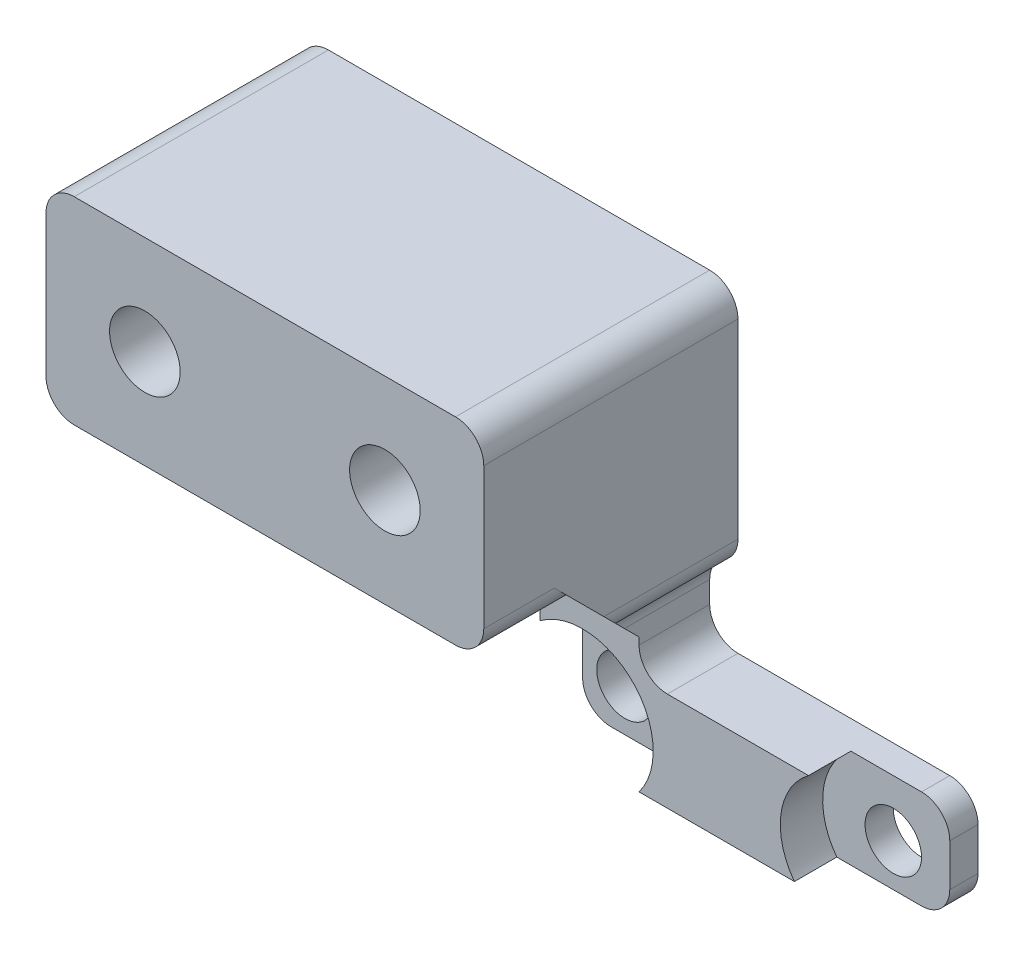
ISO-10303-21;
HEADER;
FILE_DESCRIPTION(('STEP AP214'),'2;1');
FILE_NAME('part.step','',(''),(''),'','','');
FILE_SCHEMA(('AUTOMOTIVE_DESIGN { 1 0 10303 214 1 1 1 1 }'));
ENDSEC;
DATA;
#1=APPLICATION_CONTEXT('core data for automotive mechanical design processes');
#2=APPLICATION_PROTOCOL_DEFINITION('international standard','automotive_design',2000,#1);
#3=PRODUCT_CONTEXT('',#1,'mechanical');
#4=PRODUCT('Part','Part','',(#3));
#5=PRODUCT_RELATED_PRODUCT_CATEGORY('part','',(#4));
#6=PRODUCT_DEFINITION_FORMATION('','',#4);
#7=PRODUCT_DEFINITION_CONTEXT('part definition',#1,'design');
#8=PRODUCT_DEFINITION('design','',#6,#7);
#9=PRODUCT_DEFINITION_SHAPE('','',#8);
#10=(LENGTH_UNIT() NAMED_UNIT(*) SI_UNIT(.MILLI.,.METRE.));
#11=(NAMED_UNIT(*) PLANE_ANGLE_UNIT() SI_UNIT($,.RADIAN.));
#12=(NAMED_UNIT(*) SI_UNIT($,.STERADIAN.) SOLID_ANGLE_UNIT());
#13=UNCERTAINTY_MEASURE_WITH_UNIT(LENGTH_MEASURE(1.E-05),#10,'distance_accuracy_value','');
#14=(GEOMETRIC_REPRESENTATION_CONTEXT(3) GLOBAL_UNCERTAINTY_ASSIGNED_CONTEXT((#13)) GLOBAL_UNIT_ASSIGNED_CONTEXT((#10,
#11,#12)) REPRESENTATION_CONTEXT('',''));
#15=CARTESIAN_POINT('',(0.,0.,0.));
#16=DIRECTION('',(0.,0.,1.));
#17=DIRECTION('',(1.,0.,0.));
#18=AXIS2_PLACEMENT_3D('',#15,#16,#17);
#19=CARTESIAN_POINT('',(-17.2611972553893,18.0150602409639,8.));
#20=DIRECTION('',(0.,0.,-1.));
#21=DIRECTION('',(-1.,0.,0.));
#22=AXIS2_PLACEMENT_3D('',#19,#20,#21);
#23=PLANE('',#22);
#24=CARTESIAN_POINT('',(-17.2611972553893,18.0150602409639,8.));
#25=DIRECTION('',(0.,0.,-1.));
#26=DIRECTION('',(-1.,0.,0.));
#27=AXIS2_PLACEMENT_3D('',#24,#25,#26);
#28=CIRCLE('',#27,2.5);
#29=CARTESIAN_POINT('',(-19.7611972553893,18.0150602409639,8.));
#30=VERTEX_POINT('',#29);
#31=EDGE_CURVE('E429',#30,#30,#28,.F.);
#32=ORIENTED_EDGE('',*,*,#31,.T.);
#33=EDGE_LOOP('',(#32));
#34=FACE_BOUND('',#33,.T.);
#35=CARTESIAN_POINT('',(-17.2611972553893,18.0150602409639,8.));
#36=DIRECTION('',(0.,0.,-1.));
#37=DIRECTION('',(-1.,0.,0.));
#38=AXIS2_PLACEMENT_3D('',#35,#36,#37);
#39=CIRCLE('',#38,3.75);
#40=CARTESIAN_POINT('',(-21.0111972553893,18.0150602409639,8.));
#41=VERTEX_POINT('',#40);
#42=EDGE_CURVE('E415',#41,#41,#39,.T.);
#43=ORIENTED_EDGE('',*,*,#42,.T.);
#44=EDGE_LOOP('',(#43));
#45=FACE_BOUND('',#44,.T.);
#46=ADVANCED_FACE('F34',(#34,#45),#23,.T.);
#47=CARTESIAN_POINT('',(-0.261197255389315,18.0150602409639,8.));
#48=DIRECTION('',(0.,0.,-1.));
#49=DIRECTION('',(-1.,0.,0.));
#50=AXIS2_PLACEMENT_3D('',#47,#48,#49);
#51=CIRCLE('',#50,2.5);
#52=CARTESIAN_POINT('',(-2.76119725538932,18.0150602409639,8.));
#53=VERTEX_POINT('',#52);
#54=EDGE_CURVE('E422',#53,#53,#51,.F.);
#55=ORIENTED_EDGE('',*,*,#54,.T.);
#56=EDGE_LOOP('',(#55));
#57=FACE_BOUND('',#56,.T.);
#58=CARTESIAN_POINT('',(-0.261197255389315,18.0150602409639,8.));
#59=DIRECTION('',(0.,0.,-1.));
#60=DIRECTION('',(-1.,0.,0.));
#61=AXIS2_PLACEMENT_3D('',#58,#59,#60);
#62=CIRCLE('',#61,3.75);
#63=CARTESIAN_POINT('',(-4.01119725538931,18.0150602409639,8.));
#64=VERTEX_POINT('',#63);
#65=EDGE_CURVE('E418',#64,#64,#62,.T.);
#66=ORIENTED_EDGE('',*,*,#65,.T.);
#67=EDGE_LOOP('',(#66));
#68=FACE_BOUND('',#67,.T.);
#69=ADVANCED_FACE('F537',(#57,#68),#23,.T.);
#70=CARTESIAN_POINT('',(0.,0.,5.));
#71=DIRECTION('',(0.,0.,1.));
#72=DIRECTION('',(1.,0.,0.));
#73=AXIS2_PLACEMENT_3D('',#70,#71,#72);
#74=PLANE('',#73);
#75=DIRECTION('',(-1.,0.,0.));
#76=VECTOR('',#75,1.);
#77=CARTESIAN_POINT('',(0.,2.51506024096387,5.));
#78=LINE('',#77,#76);
#79=CARTESIAN_POINT('',(16.7388027446107,2.51506024096387,5.));
#80=VERTEX_POINT('',#79);
#81=CARTESIAN_POINT('',(6.73880274461068,2.51506024096387,5.));
#82=VERTEX_POINT('',#81);
#83=EDGE_CURVE('E313',#80,#82,#78,.T.);
#84=ORIENTED_EDGE('',*,*,#83,.T.);
#85=CARTESIAN_POINT('',(6.73880274461068,4.51506024096387,5.));
#86=DIRECTION('',(0.,0.,1.));
#87=DIRECTION('',(1.,0.,0.));
#88=AXIS2_PLACEMENT_3D('',#85,#86,#87);
#89=CIRCLE('',#88,2.);
#90=CARTESIAN_POINT('',(4.73880274461068,4.51506024096387,5.));
#91=VERTEX_POINT('',#90);
#92=EDGE_CURVE('E228',#82,#91,#89,.F.);
#93=ORIENTED_EDGE('',*,*,#92,.T.);
#94=DIRECTION('',(0.,1.,0.));
#95=VECTOR('',#94,1.);
#96=CARTESIAN_POINT('',(4.73880274461068,0.,5.));
#97=LINE('',#96,#95);
#98=CARTESIAN_POINT('',(4.73880274461068,5.01506024096389,5.));
#99=VERTEX_POINT('',#98);
#100=EDGE_CURVE('E213',#91,#99,#97,.T.);
#101=ORIENTED_EDGE('',*,*,#100,.T.);
#102=DIRECTION('',(-1.,0.,0.));
#103=VECTOR('',#102,1.);
#104=CARTESIAN_POINT('',(0.,5.01506024096389,5.));
#105=LINE('',#104,#103);
#106=CARTESIAN_POINT('',(-2.26119725538932,5.01506024096389,5.));
#107=VERTEX_POINT('',#106);
#108=EDGE_CURVE('E225',#99,#107,#105,.T.);
#109=ORIENTED_EDGE('',*,*,#108,.T.);
#110=DIRECTION('',(0.,1.,0.));
#111=VECTOR('',#110,1.);
#112=CARTESIAN_POINT('',(-2.26119725538932,0.,5.));
#113=LINE('',#112,#111);
#114=CARTESIAN_POINT('',(-2.26119725538932,2.51506024096387,5.));
#115=VERTEX_POINT('',#114);
#116=EDGE_CURVE('E309',#115,#107,#113,.T.);
#117=ORIENTED_EDGE('',*,*,#116,.F.);
#118=CARTESIAN_POINT('',(0.738802744610682,-1.48493975903613,5.));
#119=DIRECTION('',(0.,0.,1.));
#120=DIRECTION('',(1.,0.,0.));
#121=AXIS2_PLACEMENT_3D('',#118,#119,#120);
#122=CIRCLE('',#121,5.);
#123=CARTESIAN_POINT('',(4.73880274461069,-4.48493975903613,5.));
#124=VERTEX_POINT('',#123);
#125=EDGE_CURVE('E310',#124,#115,#122,.T.);
#126=ORIENTED_EDGE('',*,*,#125,.F.);
#127=DIRECTION('',(-1.,0.,0.));
#128=VECTOR('',#127,1.);
#129=CARTESIAN_POINT('',(0.,-4.48493975903613,5.));
#130=LINE('',#129,#128);
#131=CARTESIAN_POINT('',(15.7388027446107,-4.48493975903613,5.));
#132=VERTEX_POINT('',#131);
#133=EDGE_CURVE('E465',#132,#124,#130,.T.);
#134=ORIENTED_EDGE('',*,*,#133,.F.);
#135=CARTESIAN_POINT('',(19.7388027446107,-1.48493975903613,5.));
#136=DIRECTION('',(0.,0.,1.));
#137=DIRECTION('',(1.,0.,0.));
#138=AXIS2_PLACEMENT_3D('',#135,#136,#137);
#139=CIRCLE('',#138,5.);
#140=EDGE_CURVE('E312',#80,#132,#139,.T.);
#141=ORIENTED_EDGE('',*,*,#140,.F.);
#142=EDGE_LOOP('',(#84,#93,#101,#109,#117,#126,#134,#141));
#143=FACE_BOUND('',#142,.T.);
#144=ADVANCED_FACE('F223',(#143),#74,.T.);
#145=CARTESIAN_POINT('',(-2.26119725538932,0.,5.));
#146=DIRECTION('',(-1.,0.,0.));
#147=DIRECTION('',(0.,0.,1.));
#148=AXIS2_PLACEMENT_3D('',#145,#146,#147);
#149=PLANE('',#148);
#150=DIRECTION('',(0.,0.707106781186544,0.707106781186551));
#151=VECTOR('',#150,1.);
#152=CARTESIAN_POINT('',(-2.26119725538932,11.0150602409639,11.));
#153=LINE('',#152,#151);
#154=CARTESIAN_POINT('',(-2.26119725538932,9.01506024096387,9.00000000000002));
#155=VERTEX_POINT('',#154);
#156=EDGE_CURVE('E233',#107,#155,#153,.T.);
#157=ORIENTED_EDGE('',*,*,#156,.T.);
#158=DIRECTION('',(0.,0.,1.));
#159=VECTOR('',#158,1.);
#160=CARTESIAN_POINT('',(-2.26119725538932,9.01506024096387,5.));
#161=LINE('',#160,#159);
#162=CARTESIAN_POINT('',(-2.26119725538932,9.01506024096387,0.));
#163=VERTEX_POINT('',#162);
#164=EDGE_CURVE('E55',#155,#163,#161,.F.);
#165=ORIENTED_EDGE('',*,*,#164,.T.);
#166=DIRECTION('',(0.,1.,0.));
#167=VECTOR('',#166,1.);
#168=CARTESIAN_POINT('',(-2.26119725538932,0.,0.));
#169=LINE('',#168,#167);
#170=CARTESIAN_POINT('',(-2.26119725538932,-2.48493975903613,0.));
#171=VERTEX_POINT('',#170);
#172=EDGE_CURVE('E290',#171,#163,#169,.T.);
#173=ORIENTED_EDGE('',*,*,#172,.F.);
#174=DIRECTION('',(0.,0.,-1.));
#175=VECTOR('',#174,1.);
#176=CARTESIAN_POINT('',(-2.26119725538932,-2.48493975903613,5.));
#177=LINE('',#176,#175);
#178=CARTESIAN_POINT('',(-2.26119725538932,-2.48493975903613,2.));
#179=VERTEX_POINT('',#178);
#180=EDGE_CURVE('E342',#171,#179,#177,.F.);
#181=ORIENTED_EDGE('',*,*,#180,.T.);
#182=DIRECTION('',(0.,1.,0.));
#183=VECTOR('',#182,1.);
#184=CARTESIAN_POINT('',(-2.26119725538932,0.,2.));
#185=LINE('',#184,#183);
#186=CARTESIAN_POINT('',(-2.26119725538932,2.51506024096387,2.));
#187=VERTEX_POINT('',#186);
#188=EDGE_CURVE('E462',#179,#187,#185,.T.);
#189=ORIENTED_EDGE('',*,*,#188,.T.);
#190=DIRECTION('',(0.,0.,1.));
#191=VECTOR('',#190,1.);
#192=CARTESIAN_POINT('',(-2.26119725538932,2.51506024096387,2.));
#193=LINE('',#192,#191);
#194=EDGE_CURVE('E318',#115,#187,#193,.F.);
#195=ORIENTED_EDGE('',*,*,#194,.F.);
#196=ORIENTED_EDGE('',*,*,#116,.T.);
#197=EDGE_LOOP('',(#157,#165,#173,#181,#189,#195,#196));
#198=FACE_BOUND('',#197,.T.);
#199=ADVANCED_FACE('F521',(#198),#149,.T.);
#200=CARTESIAN_POINT('',(0.,2.51506024096387,5.));
#201=DIRECTION('',(0.,-1.,0.));
#202=DIRECTION('',(1.,0.,0.));
#203=AXIS2_PLACEMENT_3D('',#200,#201,#202);
#204=PLANE('',#203);
#205=DIRECTION('',(-1.,0.,0.));
#206=VECTOR('',#205,1.);
#207=CARTESIAN_POINT('',(0.,2.51506024096387,0.));
#208=LINE('',#207,#206);
#209=CARTESIAN_POINT('',(21.7388027446107,2.51506024096387,0.));
#210=VERTEX_POINT('',#209);
#211=CARTESIAN_POINT('',(6.73880274461068,2.51506024096387,0.));
#212=VERTEX_POINT('',#211);
#213=EDGE_CURVE('E306',#210,#212,#208,.T.);
#214=ORIENTED_EDGE('',*,*,#213,.T.);
#215=DIRECTION('',(0.,0.,-1.));
#216=VECTOR('',#215,1.);
#217=CARTESIAN_POINT('',(6.73880274461068,2.51506024096387,5.));
#218=LINE('',#217,#216);
#219=EDGE_CURVE('E255',#212,#82,#218,.F.);
#220=ORIENTED_EDGE('',*,*,#219,.T.);
#221=ORIENTED_EDGE('',*,*,#83,.F.);
#222=DIRECTION('',(0.,0.,1.));
#223=VECTOR('',#222,1.);
#224=CARTESIAN_POINT('',(16.7388027446107,2.51506024096387,2.));
#225=LINE('',#224,#223);
#226=CARTESIAN_POINT('',(16.7388027446107,2.51506024096387,2.));
#227=VERTEX_POINT('',#226);
#228=EDGE_CURVE('E441',#80,#227,#225,.F.);
#229=ORIENTED_EDGE('',*,*,#228,.T.);
#230=DIRECTION('',(-1.,0.,0.));
#231=VECTOR('',#230,1.);
#232=CARTESIAN_POINT('',(0.,2.51506024096387,2.));
#233=LINE('',#232,#231);
#234=CARTESIAN_POINT('',(21.7388027446107,2.51506024096387,2.));
#235=VERTEX_POINT('',#234);
#236=EDGE_CURVE('E324',#235,#227,#233,.T.);
#237=ORIENTED_EDGE('',*,*,#236,.F.);
#238=DIRECTION('',(0.,0.,-1.));
#239=VECTOR('',#238,1.);
#240=CARTESIAN_POINT('',(21.7388027446107,2.51506024096387,5.));
#241=LINE('',#240,#239);
#242=EDGE_CURVE('E355',#235,#210,#241,.T.);
#243=ORIENTED_EDGE('',*,*,#242,.T.);
#244=EDGE_LOOP('',(#214,#220,#221,#229,#237,#243));
#245=FACE_BOUND('',#244,.T.);
#246=ADVANCED_FACE('F508',(#245),#204,.F.);
#247=CARTESIAN_POINT('',(-17.2611972553893,18.0150602409639,0.));
#248=DIRECTION('',(0.,0.,1.));
#249=DIRECTION('',(1.,0.,0.));
#250=AXIS2_PLACEMENT_3D('',#247,#248,#249);
#251=CYLINDRICAL_SURFACE('',#250,2.5);
#252=CARTESIAN_POINT('',(-17.2611972553893,18.0150602409639,18.));
#253=DIRECTION('',(0.,0.,1.));
#254=DIRECTION('',(1.,0.,0.));
#255=AXIS2_PLACEMENT_3D('',#252,#253,#254);
#256=CIRCLE('',#255,2.5);
#257=CARTESIAN_POINT('',(-14.7611972553893,18.0150602409639,18.));
#258=VERTEX_POINT('',#257);
#259=EDGE_CURVE('E432',#258,#258,#256,.T.);
#260=ORIENTED_EDGE('',*,*,#259,.T.);
#261=EDGE_LOOP('',(#260));
#262=FACE_BOUND('',#261,.T.);
#263=ORIENTED_EDGE('',*,*,#31,.F.);
#264=EDGE_LOOP('',(#263));
#265=FACE_BOUND('',#264,.T.);
#266=ADVANCED_FACE('F558',(#262,#265),#251,.F.);
#267=CARTESIAN_POINT('',(-0.261197255389315,18.0150602409639,0.));
#268=DIRECTION('',(0.,0.,1.));
#269=DIRECTION('',(1.,0.,0.));
#270=AXIS2_PLACEMENT_3D('',#267,#268,#269);
#271=CYLINDRICAL_SURFACE('',#270,2.5);
#272=CARTESIAN_POINT('',(-0.261197255389315,18.0150602409639,18.));
#273=DIRECTION('',(0.,0.,1.));
#274=DIRECTION('',(1.,0.,0.));
#275=AXIS2_PLACEMENT_3D('',#272,#273,#274);
#276=CIRCLE('',#275,2.5);
#277=CARTESIAN_POINT('',(2.23880274461069,18.0150602409639,18.));
#278=VERTEX_POINT('',#277);
#279=EDGE_CURVE('E435',#278,#278,#276,.T.);
#280=ORIENTED_EDGE('',*,*,#279,.T.);
#281=EDGE_LOOP('',(#280));
#282=FACE_BOUND('',#281,.T.);
#283=ORIENTED_EDGE('',*,*,#54,.F.);
#284=EDGE_LOOP('',(#283));
#285=FACE_BOUND('',#284,.T.);
#286=ADVANCED_FACE('F476',(#282,#285),#271,.F.);
#287=CARTESIAN_POINT('',(19.7388027446107,-1.48493975903613,5.));
#288=DIRECTION('',(0.,0.,-1.));
#289=DIRECTION('',(-1.,0.,0.));
#290=AXIS2_PLACEMENT_3D('',#287,#288,#289);
#291=CYLINDRICAL_SURFACE('',#290,2.);
#292=CARTESIAN_POINT('',(19.7388027446107,-1.48493975903613,0.));
#293=DIRECTION('',(0.,0.,1.));
#294=DIRECTION('',(1.,0.,0.));
#295=AXIS2_PLACEMENT_3D('',#292,#293,#294);
#296=CIRCLE('',#295,2.);
#297=CARTESIAN_POINT('',(21.7388027446107,-1.48493975903613,0.));
#298=VERTEX_POINT('',#297);
#299=EDGE_CURVE('E300',#298,#298,#296,.T.);
#300=ORIENTED_EDGE('',*,*,#299,.F.);
#301=EDGE_LOOP('',(#300));
#302=FACE_BOUND('',#301,.T.);
#303=CARTESIAN_POINT('',(19.7388027446107,-1.48493975903613,2.));
#304=DIRECTION('',(0.,0.,1.));
#305=DIRECTION('',(1.,0.,0.));
#306=AXIS2_PLACEMENT_3D('',#303,#304,#305);
#307=CIRCLE('',#306,2.);
#308=CARTESIAN_POINT('',(21.7388027446107,-1.48493975903613,2.));
#309=VERTEX_POINT('',#308);
#310=EDGE_CURVE('E321',#309,#309,#307,.T.);
#311=ORIENTED_EDGE('',*,*,#310,.T.);
#312=EDGE_LOOP('',(#311));
#313=FACE_BOUND('',#312,.T.);
#314=ADVANCED_FACE('F472',(#302,#313),#291,.F.);
#315=CARTESIAN_POINT('',(0.738802744610682,-1.48493975903613,5.));
#316=DIRECTION('',(0.,0.,-1.));
#317=DIRECTION('',(-1.,0.,0.));
#318=AXIS2_PLACEMENT_3D('',#315,#316,#317);
#319=CYLINDRICAL_SURFACE('',#318,2.);
#320=CARTESIAN_POINT('',(0.738802744610682,-1.48493975903613,0.));
#321=DIRECTION('',(0.,0.,1.));
#322=DIRECTION('',(1.,0.,0.));
#323=AXIS2_PLACEMENT_3D('',#320,#321,#322);
#324=CIRCLE('',#323,2.);
#325=CARTESIAN_POINT('',(2.73880274461068,-1.48493975903613,0.));
#326=VERTEX_POINT('',#325);
#327=EDGE_CURVE('E295',#326,#326,#324,.T.);
#328=ORIENTED_EDGE('',*,*,#327,.F.);
#329=EDGE_LOOP('',(#328));
#330=FACE_BOUND('',#329,.T.);
#331=CARTESIAN_POINT('',(0.738802744610682,-1.48493975903613,2.));
#332=DIRECTION('',(0.,0.,1.));
#333=DIRECTION('',(1.,0.,0.));
#334=AXIS2_PLACEMENT_3D('',#331,#332,#333);
#335=CIRCLE('',#334,2.);
#336=CARTESIAN_POINT('',(2.73880274461068,-1.48493975903613,2.));
#337=VERTEX_POINT('',#336);
#338=EDGE_CURVE('E314',#337,#337,#335,.T.);
#339=ORIENTED_EDGE('',*,*,#338,.T.);
#340=EDGE_LOOP('',(#339));
#341=FACE_BOUND('',#340,.T.);
#342=ADVANCED_FACE('F475',(#330,#341),#319,.F.);
#343=CARTESIAN_POINT('',(0.,-4.48493975903613,5.));
#344=DIRECTION('',(0.,-1.,0.));
#345=DIRECTION('',(0.,0.,-1.));
#346=AXIS2_PLACEMENT_3D('',#343,#344,#345);
#347=PLANE('',#346);
#348=DIRECTION('',(-1.,0.,0.));
#349=VECTOR('',#348,1.);
#350=CARTESIAN_POINT('',(0.,-4.48493975903613,2.));
#351=LINE('',#350,#349);
#352=CARTESIAN_POINT('',(4.73880274461069,-4.48493975903613,2.));
#353=VERTEX_POINT('',#352);
#354=CARTESIAN_POINT('',(-0.261197255389315,-4.48493975903613,2.));
#355=VERTEX_POINT('',#354);
#356=EDGE_CURVE('E317',#353,#355,#351,.T.);
#357=ORIENTED_EDGE('',*,*,#356,.T.);
#358=DIRECTION('',(0.,0.,-1.));
#359=VECTOR('',#358,1.);
#360=CARTESIAN_POINT('',(-0.261197255389315,-4.48493975903613,5.));
#361=LINE('',#360,#359);
#362=CARTESIAN_POINT('',(-0.261197255389315,-4.48493975903613,0.));
#363=VERTEX_POINT('',#362);
#364=EDGE_CURVE('E327',#355,#363,#361,.T.);
#365=ORIENTED_EDGE('',*,*,#364,.T.);
#366=DIRECTION('',(-1.,0.,0.));
#367=VECTOR('',#366,1.);
#368=CARTESIAN_POINT('',(0.,-4.48493975903613,0.));
#369=LINE('',#368,#367);
#370=CARTESIAN_POINT('',(21.7388027446107,-4.48493975903613,0.));
#371=VERTEX_POINT('',#370);
#372=EDGE_CURVE('E294',#371,#363,#369,.T.);
#373=ORIENTED_EDGE('',*,*,#372,.F.);
#374=DIRECTION('',(0.,0.,-1.));
#375=VECTOR('',#374,1.);
#376=CARTESIAN_POINT('',(21.7388027446107,-4.48493975903613,2.));
#377=LINE('',#376,#375);
#378=CARTESIAN_POINT('',(21.7388027446107,-4.48493975903613,2.));
#379=VERTEX_POINT('',#378);
#380=EDGE_CURVE('E320',#371,#379,#377,.F.);
#381=ORIENTED_EDGE('',*,*,#380,.T.);
#382=DIRECTION('',(-1.,0.,0.));
#383=VECTOR('',#382,1.);
#384=CARTESIAN_POINT('',(0.,-4.48493975903613,2.));
#385=LINE('',#384,#383);
#386=CARTESIAN_POINT('',(15.7388027446107,-4.48493975903613,2.));
#387=VERTEX_POINT('',#386);
#388=EDGE_CURVE('E450',#379,#387,#385,.T.);
#389=ORIENTED_EDGE('',*,*,#388,.T.);
#390=DIRECTION('',(0.,0.,1.));
#391=VECTOR('',#390,1.);
#392=CARTESIAN_POINT('',(15.7388027446107,-4.48493975903613,2.));
#393=LINE('',#392,#391);
#394=EDGE_CURVE('E325',#132,#387,#393,.F.);
#395=ORIENTED_EDGE('',*,*,#394,.F.);
#396=ORIENTED_EDGE('',*,*,#133,.T.);
#397=DIRECTION('',(0.,0.,1.));
#398=VECTOR('',#397,1.);
#399=CARTESIAN_POINT('',(4.73880274461069,-4.48493975903613,2.));
#400=LINE('',#399,#398);
#401=EDGE_CURVE('E455',#353,#124,#400,.T.);
#402=ORIENTED_EDGE('',*,*,#401,.F.);
#403=EDGE_LOOP('',(#357,#365,#373,#381,#389,#395,#396,#402));
#404=FACE_BOUND('',#403,.T.);
#405=ADVANCED_FACE('F514',(#404),#347,.T.);
#406=CARTESIAN_POINT('',(23.7388027446107,0.,5.));
#407=DIRECTION('',(-1.,0.,0.));
#408=DIRECTION('',(0.,0.,1.));
#409=AXIS2_PLACEMENT_3D('',#406,#407,#408);
#410=PLANE('',#409);
#411=DIRECTION('',(0.,1.,0.));
#412=VECTOR('',#411,1.);
#413=CARTESIAN_POINT('',(23.7388027446107,0.,2.));
#414=LINE('',#413,#412);
#415=CARTESIAN_POINT('',(23.7388027446107,-2.48493975903613,2.));
#416=VERTEX_POINT('',#415);
#417=CARTESIAN_POINT('',(23.7388027446107,0.515060240963871,2.));
#418=VERTEX_POINT('',#417);
#419=EDGE_CURVE('E447',#416,#418,#414,.T.);
#420=ORIENTED_EDGE('',*,*,#419,.F.);
#421=DIRECTION('',(0.,0.,-1.));
#422=VECTOR('',#421,1.);
#423=CARTESIAN_POINT('',(23.7388027446107,-2.48493975903613,0.));
#424=LINE('',#423,#422);
#425=CARTESIAN_POINT('',(23.7388027446107,-2.48493975903613,0.));
#426=VERTEX_POINT('',#425);
#427=EDGE_CURVE('E348',#416,#426,#424,.T.);
#428=ORIENTED_EDGE('',*,*,#427,.T.);
#429=DIRECTION('',(0.,1.,0.));
#430=VECTOR('',#429,1.);
#431=CARTESIAN_POINT('',(23.7388027446107,0.,0.));
#432=LINE('',#431,#430);
#433=CARTESIAN_POINT('',(23.7388027446107,0.515060240963871,0.));
#434=VERTEX_POINT('',#433);
#435=EDGE_CURVE('E297',#426,#434,#432,.T.);
#436=ORIENTED_EDGE('',*,*,#435,.T.);
#437=DIRECTION('',(0.,0.,-1.));
#438=VECTOR('',#437,1.);
#439=CARTESIAN_POINT('',(23.7388027446107,0.515060240963871,5.));
#440=LINE('',#439,#438);
#441=EDGE_CURVE('E346',#434,#418,#440,.F.);
#442=ORIENTED_EDGE('',*,*,#441,.T.);
#443=EDGE_LOOP('',(#420,#428,#436,#442));
#444=FACE_BOUND('',#443,.T.);
#445=ADVANCED_FACE('F498',(#444),#410,.F.);
#446=CARTESIAN_POINT('',(0.,0.,0.));
#447=DIRECTION('',(0.,0.,1.));
#448=DIRECTION('',(1.,0.,0.));
#449=AXIS2_PLACEMENT_3D('',#446,#447,#448);
#450=PLANE('',#449);
#451=CARTESIAN_POINT('',(-17.2611972553893,18.0150602409639,0.));
#452=DIRECTION('',(0.,0.,-1.));
#453=DIRECTION('',(-1.,0.,0.));
#454=AXIS2_PLACEMENT_3D('',#451,#452,#453);
#455=CIRCLE('',#454,3.75);
#456=CARTESIAN_POINT('',(-21.0111972553893,18.0150602409639,0.));
#457=VERTEX_POINT('',#456);
#458=EDGE_CURVE('E414',#457,#457,#455,.T.);
#459=ORIENTED_EDGE('',*,*,#458,.F.);
#460=EDGE_LOOP('',(#459));
#461=FACE_BOUND('',#460,.T.);
#462=CARTESIAN_POINT('',(-0.261197255389315,18.0150602409639,0.));
#463=DIRECTION('',(0.,0.,-1.));
#464=DIRECTION('',(-1.,0.,0.));
#465=AXIS2_PLACEMENT_3D('',#462,#463,#464);
#466=CIRCLE('',#465,3.75);
#467=CARTESIAN_POINT('',(-4.01119725538931,18.0150602409639,0.));
#468=VERTEX_POINT('',#467);
#469=EDGE_CURVE('E419',#468,#468,#466,.T.);
#470=ORIENTED_EDGE('',*,*,#469,.F.);
#471=EDGE_LOOP('',(#470));
#472=FACE_BOUND('',#471,.T.);
#473=ORIENTED_EDGE('',*,*,#299,.T.);
#474=EDGE_LOOP('',(#473));
#475=FACE_BOUND('',#474,.T.);
#476=ORIENTED_EDGE('',*,*,#327,.T.);
#477=EDGE_LOOP('',(#476));
#478=FACE_BOUND('',#477,.T.);
#479=DIRECTION('',(0.,1.,0.));
#480=VECTOR('',#479,1.);
#481=CARTESIAN_POINT('',(6.73880274461068,23.0150602409639,0.));
#482=LINE('',#481,#480);
#483=CARTESIAN_POINT('',(6.73880274461068,9.51506024096387,0.));
#484=VERTEX_POINT('',#483);
#485=CARTESIAN_POINT('',(6.73880274461068,23.0150602409639,0.));
#486=VERTEX_POINT('',#485);
#487=EDGE_CURVE('E383',#484,#486,#482,.T.);
#488=ORIENTED_EDGE('',*,*,#487,.F.);
#489=CARTESIAN_POINT('',(4.73880274461068,9.51506024096387,0.));
#490=DIRECTION('',(0.,0.,1.));
#491=DIRECTION('',(1.,0.,0.));
#492=AXIS2_PLACEMENT_3D('',#489,#490,#491);
#493=CIRCLE('',#492,2.);
#494=CARTESIAN_POINT('',(5.73880274461068,7.78300943339499,0.));
#495=VERTEX_POINT('',#494);
#496=EDGE_CURVE('E261',#484,#495,#493,.F.);
#497=ORIENTED_EDGE('',*,*,#496,.T.);
#498=CARTESIAN_POINT('',(6.73880274461068,6.05095862582611,0.));
#499=DIRECTION('',(0.,0.,1.));
#500=DIRECTION('',(1.,0.,0.));
#501=AXIS2_PLACEMENT_3D('',#498,#499,#500);
#502=CIRCLE('',#501,2.);
#503=CARTESIAN_POINT('',(4.73880274461068,6.05095862582611,0.));
#504=VERTEX_POINT('',#503);
#505=EDGE_CURVE('E272',#495,#504,#502,.T.);
#506=ORIENTED_EDGE('',*,*,#505,.T.);
#507=DIRECTION('',(0.,1.,0.));
#508=VECTOR('',#507,1.);
#509=CARTESIAN_POINT('',(4.73880274461068,2.51506024096387,0.));
#510=LINE('',#509,#508);
#511=CARTESIAN_POINT('',(4.73880274461068,4.51506024096387,0.));
#512=VERTEX_POINT('',#511);
#513=EDGE_CURVE('E230',#512,#504,#510,.T.);
#514=ORIENTED_EDGE('',*,*,#513,.F.);
#515=CARTESIAN_POINT('',(6.73880274461068,4.51506024096387,0.));
#516=DIRECTION('',(0.,0.,1.));
#517=DIRECTION('',(1.,0.,0.));
#518=AXIS2_PLACEMENT_3D('',#515,#516,#517);
#519=CIRCLE('',#518,2.);
#520=EDGE_CURVE('E264',#512,#212,#519,.T.);
#521=ORIENTED_EDGE('',*,*,#520,.T.);
#522=ORIENTED_EDGE('',*,*,#213,.F.);
#523=CARTESIAN_POINT('',(21.7388027446107,0.515060240963871,0.));
#524=DIRECTION('',(0.,0.,1.));
#525=DIRECTION('',(1.,0.,0.));
#526=AXIS2_PLACEMENT_3D('',#523,#524,#525);
#527=CIRCLE('',#526,2.);
#528=EDGE_CURVE('E337',#210,#434,#527,.F.);
#529=ORIENTED_EDGE('',*,*,#528,.T.);
#530=ORIENTED_EDGE('',*,*,#435,.F.);
#531=CARTESIAN_POINT('',(21.7388027446107,-2.48493975903613,0.));
#532=DIRECTION('',(0.,0.,1.));
#533=DIRECTION('',(1.,0.,0.));
#534=AXIS2_PLACEMENT_3D('',#531,#532,#533);
#535=CIRCLE('',#534,2.);
#536=EDGE_CURVE('E339',#426,#371,#535,.F.);
#537=ORIENTED_EDGE('',*,*,#536,.T.);
#538=ORIENTED_EDGE('',*,*,#372,.T.);
#539=CARTESIAN_POINT('',(-0.261197255389315,-2.48493975903613,0.));
#540=DIRECTION('',(0.,0.,1.));
#541=DIRECTION('',(1.,0.,0.));
#542=AXIS2_PLACEMENT_3D('',#539,#540,#541);
#543=CIRCLE('',#542,2.);
#544=EDGE_CURVE('E292',#363,#171,#543,.F.);
#545=ORIENTED_EDGE('',*,*,#544,.T.);
#546=ORIENTED_EDGE('',*,*,#172,.T.);
#547=CARTESIAN_POINT('',(-4.26119725538932,9.01506024096387,0.));
#548=DIRECTION('',(0.,0.,1.));
#549=DIRECTION('',(1.,0.,0.));
#550=AXIS2_PLACEMENT_3D('',#547,#548,#549);
#551=CIRCLE('',#550,2.);
#552=CARTESIAN_POINT('',(-4.26119725538932,11.0150602409639,0.));
#553=VERTEX_POINT('',#552);
#554=EDGE_CURVE('E11',#163,#553,#551,.T.);
#555=ORIENTED_EDGE('',*,*,#554,.T.);
#556=DIRECTION('',(1.,0.,0.));
#557=VECTOR('',#556,1.);
#558=CARTESIAN_POINT('',(-2.26119725538932,11.0150602409639,0.));
#559=LINE('',#558,#557);
#560=CARTESIAN_POINT('',(-22.2611972553893,11.0150602409639,0.));
#561=VERTEX_POINT('',#560);
#562=EDGE_CURVE('E284',#561,#553,#559,.T.);
#563=ORIENTED_EDGE('',*,*,#562,.F.);
#564=CARTESIAN_POINT('',(-22.2611972553893,13.0150602409639,0.));
#565=DIRECTION('',(0.,0.,1.));
#566=DIRECTION('',(1.,0.,0.));
#567=AXIS2_PLACEMENT_3D('',#564,#565,#566);
#568=CIRCLE('',#567,2.);
#569=CARTESIAN_POINT('',(-24.2611972553893,13.0150602409639,0.));
#570=VERTEX_POINT('',#569);
#571=EDGE_CURVE('E335',#561,#570,#568,.F.);
#572=ORIENTED_EDGE('',*,*,#571,.T.);
#573=DIRECTION('',(0.,-1.,0.));
#574=VECTOR('',#573,1.);
#575=CARTESIAN_POINT('',(-24.2611972553893,13.0150602409639,0.));
#576=LINE('',#575,#574);
#577=CARTESIAN_POINT('',(-24.2611972553893,23.0150602409639,0.));
#578=VERTEX_POINT('',#577);
#579=EDGE_CURVE('E391',#578,#570,#576,.T.);
#580=ORIENTED_EDGE('',*,*,#579,.F.);
#581=CARTESIAN_POINT('',(-22.2611972553893,23.0150602409639,0.));
#582=DIRECTION('',(0.,0.,1.));
#583=DIRECTION('',(1.,0.,0.));
#584=AXIS2_PLACEMENT_3D('',#581,#582,#583);
#585=CIRCLE('',#584,2.);
#586=CARTESIAN_POINT('',(-22.2611972553893,25.0150602409639,0.));
#587=VERTEX_POINT('',#586);
#588=EDGE_CURVE('E333',#578,#587,#585,.F.);
#589=ORIENTED_EDGE('',*,*,#588,.T.);
#590=DIRECTION('',(-1.,0.,0.));
#591=VECTOR('',#590,1.);
#592=CARTESIAN_POINT('',(-24.2611972553893,25.0150602409639,0.));
#593=LINE('',#592,#591);
#594=CARTESIAN_POINT('',(4.73880274461069,25.0150602409639,0.));
#595=VERTEX_POINT('',#594);
#596=EDGE_CURVE('E399',#595,#587,#593,.T.);
#597=ORIENTED_EDGE('',*,*,#596,.F.);
#598=CARTESIAN_POINT('',(4.73880274461068,23.0150602409639,0.));
#599=DIRECTION('',(0.,0.,1.));
#600=DIRECTION('',(1.,0.,0.));
#601=AXIS2_PLACEMENT_3D('',#598,#599,#600);
#602=CIRCLE('',#601,2.);
#603=EDGE_CURVE('E330',#595,#486,#602,.F.);
#604=ORIENTED_EDGE('',*,*,#603,.T.);
#605=EDGE_LOOP('',(#488,#497,#506,#514,#521,#522,#529,#530,#537,#538,#545,#546,#555,#563,#572,
#580,#589,#597,#604));
#606=FACE_BOUND('',#605,.T.);
#607=ADVANCED_FACE('F289',(#461,#472,#475,#478,#606),#450,.F.);
#608=CARTESIAN_POINT('',(0.738802744610682,-1.48493975903613,2.));
#609=DIRECTION('',(0.,0.,1.));
#610=DIRECTION('',(1.,0.,0.));
#611=AXIS2_PLACEMENT_3D('',#608,#609,#610);
#612=CYLINDRICAL_SURFACE('',#611,5.);
#613=ORIENTED_EDGE('',*,*,#194,.T.);
#614=CARTESIAN_POINT('',(0.738802744610682,-1.48493975903613,2.));
#615=DIRECTION('',(0.,0.,1.));
#616=DIRECTION('',(1.,0.,0.));
#617=AXIS2_PLACEMENT_3D('',#614,#615,#616);
#618=CIRCLE('',#617,5.);
#619=EDGE_CURVE('E452',#353,#187,#618,.T.);
#620=ORIENTED_EDGE('',*,*,#619,.F.);
#621=ORIENTED_EDGE('',*,*,#401,.T.);
#622=ORIENTED_EDGE('',*,*,#125,.T.);
#623=EDGE_LOOP('',(#613,#620,#621,#622));
#624=FACE_BOUND('',#623,.T.);
#625=ADVANCED_FACE('F519',(#624),#612,.F.);
#626=CARTESIAN_POINT('',(0.738802744610682,-1.48493975903613,2.));
#627=DIRECTION('',(0.,0.,1.));
#628=DIRECTION('',(1.,0.,0.));
#629=AXIS2_PLACEMENT_3D('',#626,#627,#628);
#630=PLANE('',#629);
#631=ORIENTED_EDGE('',*,*,#338,.F.);
#632=EDGE_LOOP('',(#631));
#633=FACE_BOUND('',#632,.T.);
#634=ORIENTED_EDGE('',*,*,#188,.F.);
#635=CARTESIAN_POINT('',(-0.261197255389315,-2.48493975903613,2.));
#636=DIRECTION('',(0.,0.,1.));
#637=DIRECTION('',(1.,0.,0.));
#638=AXIS2_PLACEMENT_3D('',#635,#636,#637);
#639=CIRCLE('',#638,2.);
#640=EDGE_CURVE('E344',#179,#355,#639,.T.);
#641=ORIENTED_EDGE('',*,*,#640,.T.);
#642=ORIENTED_EDGE('',*,*,#356,.F.);
#643=ORIENTED_EDGE('',*,*,#619,.T.);
#644=EDGE_LOOP('',(#634,#641,#642,#643));
#645=FACE_BOUND('',#644,.T.);
#646=ADVANCED_FACE('F484',(#633,#645),#630,.T.);
#647=CARTESIAN_POINT('',(19.7388027446107,-1.48493975903613,2.));
#648=DIRECTION('',(0.,0.,1.));
#649=DIRECTION('',(1.,0.,0.));
#650=AXIS2_PLACEMENT_3D('',#647,#648,#649);
#651=PLANE('',#650);
#652=ORIENTED_EDGE('',*,*,#310,.F.);
#653=EDGE_LOOP('',(#652));
#654=FACE_BOUND('',#653,.T.);
#655=ORIENTED_EDGE('',*,*,#388,.F.);
#656=CARTESIAN_POINT('',(21.7388027446107,-2.48493975903613,2.));
#657=DIRECTION('',(0.,0.,1.));
#658=DIRECTION('',(1.,0.,0.));
#659=AXIS2_PLACEMENT_3D('',#656,#657,#658);
#660=CIRCLE('',#659,2.);
#661=EDGE_CURVE('E353',#379,#416,#660,.T.);
#662=ORIENTED_EDGE('',*,*,#661,.T.);
#663=ORIENTED_EDGE('',*,*,#419,.T.);
#664=CARTESIAN_POINT('',(21.7388027446107,0.515060240963871,2.));
#665=DIRECTION('',(0.,0.,1.));
#666=DIRECTION('',(1.,0.,0.));
#667=AXIS2_PLACEMENT_3D('',#664,#665,#666);
#668=CIRCLE('',#667,2.);
#669=EDGE_CURVE('E351',#418,#235,#668,.T.);
#670=ORIENTED_EDGE('',*,*,#669,.T.);
#671=ORIENTED_EDGE('',*,*,#236,.T.);
#672=CARTESIAN_POINT('',(19.7388027446107,-1.48493975903613,2.));
#673=DIRECTION('',(0.,0.,1.));
#674=DIRECTION('',(1.,0.,0.));
#675=AXIS2_PLACEMENT_3D('',#672,#673,#674);
#676=CIRCLE('',#675,5.);
#677=EDGE_CURVE('E438',#227,#387,#676,.T.);
#678=ORIENTED_EDGE('',*,*,#677,.T.);
#679=EDGE_LOOP('',(#655,#662,#663,#670,#671,#678));
#680=FACE_BOUND('',#679,.T.);
#681=ADVANCED_FACE('F480',(#654,#680),#651,.T.);
#682=CARTESIAN_POINT('',(19.7388027446107,-1.48493975903613,2.));
#683=DIRECTION('',(0.,0.,1.));
#684=DIRECTION('',(1.,0.,0.));
#685=AXIS2_PLACEMENT_3D('',#682,#683,#684);
#686=CYLINDRICAL_SURFACE('',#685,5.);
#687=ORIENTED_EDGE('',*,*,#394,.T.);
#688=ORIENTED_EDGE('',*,*,#677,.F.);
#689=ORIENTED_EDGE('',*,*,#228,.F.);
#690=ORIENTED_EDGE('',*,*,#140,.T.);
#691=EDGE_LOOP('',(#687,#688,#689,#690));
#692=FACE_BOUND('',#691,.T.);
#693=ADVANCED_FACE('F483',(#692),#686,.F.);
#694=CARTESIAN_POINT('',(0.,0.,18.));
#695=DIRECTION('',(0.,0.,1.));
#696=DIRECTION('',(1.,0.,0.));
#697=AXIS2_PLACEMENT_3D('',#694,#695,#696);
#698=PLANE('',#697);
#699=ORIENTED_EDGE('',*,*,#279,.F.);
#700=EDGE_LOOP('',(#699));
#701=FACE_BOUND('',#700,.T.);
#702=ORIENTED_EDGE('',*,*,#259,.F.);
#703=EDGE_LOOP('',(#702));
#704=FACE_BOUND('',#703,.T.);
#705=DIRECTION('',(-1.,0.,0.));
#706=VECTOR('',#705,1.);
#707=CARTESIAN_POINT('',(-24.2611972553893,11.0150602409639,18.));
#708=LINE('',#707,#706);
#709=CARTESIAN_POINT('',(4.73880274461069,11.0150602409639,18.));
#710=VERTEX_POINT('',#709);
#711=CARTESIAN_POINT('',(-22.2611972553893,11.0150602409639,18.));
#712=VERTEX_POINT('',#711);
#713=EDGE_CURVE('E229',#710,#712,#708,.T.);
#714=ORIENTED_EDGE('',*,*,#713,.F.);
#715=CARTESIAN_POINT('',(4.73880274461068,13.0150602409639,18.));
#716=DIRECTION('',(0.,0.,1.));
#717=DIRECTION('',(1.,0.,0.));
#718=AXIS2_PLACEMENT_3D('',#715,#716,#717);
#719=CIRCLE('',#718,2.);
#720=CARTESIAN_POINT('',(6.73880274461068,13.0150602409639,18.));
#721=VERTEX_POINT('',#720);
#722=EDGE_CURVE('E248',#710,#721,#719,.T.);
#723=ORIENTED_EDGE('',*,*,#722,.T.);
#724=DIRECTION('',(0.,-1.,0.));
#725=VECTOR('',#724,1.);
#726=CARTESIAN_POINT('',(6.73880274461068,13.0150602409639,18.));
#727=LINE('',#726,#725);
#728=CARTESIAN_POINT('',(6.73880274461068,23.0150602409639,18.));
#729=VERTEX_POINT('',#728);
#730=EDGE_CURVE('E381',#729,#721,#727,.T.);
#731=ORIENTED_EDGE('',*,*,#730,.F.);
#732=CARTESIAN_POINT('',(4.73880274461068,23.0150602409639,18.));
#733=DIRECTION('',(0.,0.,1.));
#734=DIRECTION('',(1.,0.,0.));
#735=AXIS2_PLACEMENT_3D('',#732,#733,#734);
#736=CIRCLE('',#735,2.);
#737=CARTESIAN_POINT('',(4.73880274461069,25.0150602409639,18.));
#738=VERTEX_POINT('',#737);
#739=EDGE_CURVE('E364',#729,#738,#736,.T.);
#740=ORIENTED_EDGE('',*,*,#739,.T.);
#741=DIRECTION('',(1.,0.,0.));
#742=VECTOR('',#741,1.);
#743=CARTESIAN_POINT('',(-24.2611972553893,25.0150602409639,18.));
#744=LINE('',#743,#742);
#745=CARTESIAN_POINT('',(-22.2611972553893,25.0150602409639,18.));
#746=VERTEX_POINT('',#745);
#747=EDGE_CURVE('E401',#746,#738,#744,.T.);
#748=ORIENTED_EDGE('',*,*,#747,.F.);
#749=CARTESIAN_POINT('',(-22.2611972553893,23.0150602409639,18.));
#750=DIRECTION('',(0.,0.,1.));
#751=DIRECTION('',(1.,0.,0.));
#752=AXIS2_PLACEMENT_3D('',#749,#750,#751);
#753=CIRCLE('',#752,2.);
#754=CARTESIAN_POINT('',(-24.2611972553893,23.0150602409639,18.));
#755=VERTEX_POINT('',#754);
#756=EDGE_CURVE('E366',#746,#755,#753,.T.);
#757=ORIENTED_EDGE('',*,*,#756,.T.);
#758=DIRECTION('',(0.,1.,0.));
#759=VECTOR('',#758,1.);
#760=CARTESIAN_POINT('',(-24.2611972553893,13.0150602409639,18.));
#761=LINE('',#760,#759);
#762=CARTESIAN_POINT('',(-24.2611972553893,13.0150602409639,18.));
#763=VERTEX_POINT('',#762);
#764=EDGE_CURVE('E404',#763,#755,#761,.T.);
#765=ORIENTED_EDGE('',*,*,#764,.F.);
#766=CARTESIAN_POINT('',(-22.2611972553893,13.0150602409639,18.));
#767=DIRECTION('',(0.,0.,1.));
#768=DIRECTION('',(1.,0.,0.));
#769=AXIS2_PLACEMENT_3D('',#766,#767,#768);
#770=CIRCLE('',#769,2.);
#771=EDGE_CURVE('E368',#763,#712,#770,.T.);
#772=ORIENTED_EDGE('',*,*,#771,.T.);
#773=EDGE_LOOP('',(#714,#723,#731,#740,#748,#757,#765,#772));
#774=FACE_BOUND('',#773,.T.);
#775=ADVANCED_FACE('F388',(#701,#704,#774),#698,.T.);
#776=CARTESIAN_POINT('',(-17.2611972553893,18.0150602409639,8.));
#777=DIRECTION('',(0.,0.,-1.));
#778=DIRECTION('',(-1.,0.,0.));
#779=AXIS2_PLACEMENT_3D('',#776,#777,#778);
#780=CYLINDRICAL_SURFACE('',#779,3.75);
#781=ORIENTED_EDGE('',*,*,#458,.T.);
#782=EDGE_LOOP('',(#781));
#783=FACE_BOUND('',#782,.T.);
#784=ORIENTED_EDGE('',*,*,#42,.F.);
#785=EDGE_LOOP('',(#784));
#786=FACE_BOUND('',#785,.T.);
#787=ADVANCED_FACE('F551',(#783,#786),#780,.F.);
#788=CARTESIAN_POINT('',(-0.261197255389315,18.0150602409639,8.));
#789=DIRECTION('',(0.,0.,-1.));
#790=DIRECTION('',(-1.,0.,0.));
#791=AXIS2_PLACEMENT_3D('',#788,#789,#790);
#792=CYLINDRICAL_SURFACE('',#791,3.75);
#793=ORIENTED_EDGE('',*,*,#469,.T.);
#794=EDGE_LOOP('',(#793));
#795=FACE_BOUND('',#794,.T.);
#796=ORIENTED_EDGE('',*,*,#65,.F.);
#797=EDGE_LOOP('',(#796));
#798=FACE_BOUND('',#797,.T.);
#799=ADVANCED_FACE('F548',(#795,#798),#792,.F.);
#800=CARTESIAN_POINT('',(6.73880274461068,0.,0.));
#801=DIRECTION('',(-1.,0.,0.));
#802=DIRECTION('',(0.,0.,1.));
#803=AXIS2_PLACEMENT_3D('',#800,#801,#802);
#804=PLANE('',#803);
#805=DIRECTION('',(0.,-0.707106781186544,-0.707106781186551));
#806=VECTOR('',#805,1.);
#807=CARTESIAN_POINT('',(6.73880274461068,0.00753012048197251,-0.00753012048197243));
#808=LINE('',#807,#806);
#809=CARTESIAN_POINT('',(6.73880274461068,13.0150602409639,13.0000000000001));
#810=VERTEX_POINT('',#809);
#811=CARTESIAN_POINT('',(6.73880274461068,9.51506024096387,9.50000000000002));
#812=VERTEX_POINT('',#811);
#813=EDGE_CURVE('E234',#810,#812,#808,.T.);
#814=ORIENTED_EDGE('',*,*,#813,.T.);
#815=DIRECTION('',(0.,0.,1.));
#816=VECTOR('',#815,1.);
#817=CARTESIAN_POINT('',(6.73880274461068,9.51506024096387,0.));
#818=LINE('',#817,#816);
#819=EDGE_CURVE('E259',#812,#484,#818,.F.);
#820=ORIENTED_EDGE('',*,*,#819,.T.);
#821=ORIENTED_EDGE('',*,*,#487,.T.);
#822=DIRECTION('',(0.,0.,-1.));
#823=VECTOR('',#822,1.);
#824=CARTESIAN_POINT('',(6.73880274461068,23.0150602409639,0.));
#825=LINE('',#824,#823);
#826=EDGE_CURVE('E240',#486,#729,#825,.F.);
#827=ORIENTED_EDGE('',*,*,#826,.T.);
#828=ORIENTED_EDGE('',*,*,#730,.T.);
#829=DIRECTION('',(0.,0.,1.));
#830=VECTOR('',#829,1.);
#831=CARTESIAN_POINT('',(6.73880274461068,13.0150602409639,0.));
#832=LINE('',#831,#830);
#833=EDGE_CURVE('E250',#721,#810,#832,.F.);
#834=ORIENTED_EDGE('',*,*,#833,.T.);
#835=EDGE_LOOP('',(#814,#820,#821,#827,#828,#834));
#836=FACE_BOUND('',#835,.T.);
#837=ADVANCED_FACE('F380',(#836),#804,.F.);
#838=CARTESIAN_POINT('',(-24.2611972553893,0.,0.));
#839=DIRECTION('',(-1.,0.,0.));
#840=DIRECTION('',(0.,0.,1.));
#841=AXIS2_PLACEMENT_3D('',#838,#839,#840);
#842=PLANE('',#841);
#843=ORIENTED_EDGE('',*,*,#579,.T.);
#844=DIRECTION('',(0.,0.,-1.));
#845=VECTOR('',#844,1.);
#846=CARTESIAN_POINT('',(-24.2611972553893,13.0150602409639,18.));
#847=LINE('',#846,#845);
#848=EDGE_CURVE('E362',#570,#763,#847,.F.);
#849=ORIENTED_EDGE('',*,*,#848,.T.);
#850=ORIENTED_EDGE('',*,*,#764,.T.);
#851=DIRECTION('',(0.,0.,1.));
#852=VECTOR('',#851,1.);
#853=CARTESIAN_POINT('',(-24.2611972553893,23.0150602409639,0.));
#854=LINE('',#853,#852);
#855=EDGE_CURVE('E360',#755,#578,#854,.F.);
#856=ORIENTED_EDGE('',*,*,#855,.T.);
#857=EDGE_LOOP('',(#843,#849,#850,#856));
#858=FACE_BOUND('',#857,.T.);
#859=ADVANCED_FACE('F646',(#858),#842,.T.);
#860=CARTESIAN_POINT('',(0.,25.0150602409639,0.));
#861=DIRECTION('',(0.,-1.,0.));
#862=DIRECTION('',(0.,0.,-1.));
#863=AXIS2_PLACEMENT_3D('',#860,#861,#862);
#864=PLANE('',#863);
#865=ORIENTED_EDGE('',*,*,#596,.T.);
#866=DIRECTION('',(0.,0.,1.));
#867=VECTOR('',#866,1.);
#868=CARTESIAN_POINT('',(-22.2611972553893,25.0150602409639,18.));
#869=LINE('',#868,#867);
#870=EDGE_CURVE('E374',#587,#746,#869,.T.);
#871=ORIENTED_EDGE('',*,*,#870,.T.);
#872=ORIENTED_EDGE('',*,*,#747,.T.);
#873=DIRECTION('',(0.,0.,-1.));
#874=VECTOR('',#873,1.);
#875=CARTESIAN_POINT('',(4.73880274461068,25.0150602409639,0.));
#876=LINE('',#875,#874);
#877=EDGE_CURVE('E371',#738,#595,#876,.T.);
#878=ORIENTED_EDGE('',*,*,#877,.T.);
#879=EDGE_LOOP('',(#865,#871,#872,#878));
#880=FACE_BOUND('',#879,.T.);
#881=ADVANCED_FACE('F398',(#880),#864,.F.);
#882=CARTESIAN_POINT('',(0.,11.0150602409639,0.));
#883=DIRECTION('',(0.,1.,0.));
#884=DIRECTION('',(0.,0.,1.));
#885=AXIS2_PLACEMENT_3D('',#882,#883,#884);
#886=PLANE('',#885);
#887=ORIENTED_EDGE('',*,*,#562,.T.);
#888=DIRECTION('',(0.,0.,1.));
#889=VECTOR('',#888,1.);
#890=CARTESIAN_POINT('',(-4.26119725538932,11.0150602409639,0.));
#891=LINE('',#890,#889);
#892=CARTESIAN_POINT('',(-4.26119725538932,11.0150602409639,11.));
#893=VERTEX_POINT('',#892);
#894=EDGE_CURVE('E274',#553,#893,#891,.T.);
#895=ORIENTED_EDGE('',*,*,#894,.T.);
#896=DIRECTION('',(1.,0.,0.));
#897=VECTOR('',#896,1.);
#898=CARTESIAN_POINT('',(0.,11.0150602409639,11.));
#899=LINE('',#898,#897);
#900=CARTESIAN_POINT('',(4.73880274461068,11.0150602409639,11.));
#901=VERTEX_POINT('',#900);
#902=EDGE_CURVE('E235',#893,#901,#899,.T.);
#903=ORIENTED_EDGE('',*,*,#902,.T.);
#904=DIRECTION('',(0.,0.,1.));
#905=VECTOR('',#904,1.);
#906=CARTESIAN_POINT('',(4.73880274461068,11.0150602409639,0.));
#907=LINE('',#906,#905);
#908=EDGE_CURVE('E245',#901,#710,#907,.T.);
#909=ORIENTED_EDGE('',*,*,#908,.T.);
#910=ORIENTED_EDGE('',*,*,#713,.T.);
#911=DIRECTION('',(0.,0.,-1.));
#912=VECTOR('',#911,1.);
#913=CARTESIAN_POINT('',(-22.2611972553893,11.0150602409639,0.));
#914=LINE('',#913,#912);
#915=EDGE_CURVE('E358',#712,#561,#914,.T.);
#916=ORIENTED_EDGE('',*,*,#915,.T.);
#917=EDGE_LOOP('',(#887,#895,#903,#909,#910,#916));
#918=FACE_BOUND('',#917,.T.);
#919=ADVANCED_FACE('F280',(#918),#886,.F.);
#920=CARTESIAN_POINT('',(-0.261197255389315,-2.48493975903613,5.));
#921=DIRECTION('',(0.,0.,-1.));
#922=DIRECTION('',(-1.,0.,0.));
#923=AXIS2_PLACEMENT_3D('',#920,#921,#922);
#924=CYLINDRICAL_SURFACE('',#923,2.);
#925=ORIENTED_EDGE('',*,*,#640,.F.);
#926=ORIENTED_EDGE('',*,*,#180,.F.);
#927=ORIENTED_EDGE('',*,*,#544,.F.);
#928=ORIENTED_EDGE('',*,*,#364,.F.);
#929=EDGE_LOOP('',(#925,#926,#927,#928));
#930=FACE_BOUND('',#929,.T.);
#931=ADVANCED_FACE('F527',(#930),#924,.T.);
#932=CARTESIAN_POINT('',(21.7388027446107,-2.48493975903613,5.));
#933=DIRECTION('',(0.,0.,1.));
#934=DIRECTION('',(1.,0.,0.));
#935=AXIS2_PLACEMENT_3D('',#932,#933,#934);
#936=CYLINDRICAL_SURFACE('',#935,2.);
#937=ORIENTED_EDGE('',*,*,#661,.F.);
#938=ORIENTED_EDGE('',*,*,#380,.F.);
#939=ORIENTED_EDGE('',*,*,#536,.F.);
#940=ORIENTED_EDGE('',*,*,#427,.F.);
#941=EDGE_LOOP('',(#937,#938,#939,#940));
#942=FACE_BOUND('',#941,.T.);
#943=ADVANCED_FACE('F495',(#942),#936,.T.);
#944=CARTESIAN_POINT('',(21.7388027446107,0.515060240963871,5.));
#945=DIRECTION('',(0.,0.,-1.));
#946=DIRECTION('',(-1.,0.,0.));
#947=AXIS2_PLACEMENT_3D('',#944,#945,#946);
#948=CYLINDRICAL_SURFACE('',#947,2.);
#949=ORIENTED_EDGE('',*,*,#669,.F.);
#950=ORIENTED_EDGE('',*,*,#441,.F.);
#951=ORIENTED_EDGE('',*,*,#528,.F.);
#952=ORIENTED_EDGE('',*,*,#242,.F.);
#953=EDGE_LOOP('',(#949,#950,#951,#952));
#954=FACE_BOUND('',#953,.T.);
#955=ADVANCED_FACE('F505',(#954),#948,.T.);
#956=CARTESIAN_POINT('',(-22.2611972553893,13.0150602409639,0.));
#957=DIRECTION('',(0.,0.,1.));
#958=DIRECTION('',(1.,0.,0.));
#959=AXIS2_PLACEMENT_3D('',#956,#957,#958);
#960=CYLINDRICAL_SURFACE('',#959,2.);
#961=ORIENTED_EDGE('',*,*,#771,.F.);
#962=ORIENTED_EDGE('',*,*,#848,.F.);
#963=ORIENTED_EDGE('',*,*,#571,.F.);
#964=ORIENTED_EDGE('',*,*,#915,.F.);
#965=EDGE_LOOP('',(#961,#962,#963,#964));
#966=FACE_BOUND('',#965,.T.);
#967=ADVANCED_FACE('F869',(#966),#960,.T.);
#968=CARTESIAN_POINT('',(-22.2611972553893,23.0150602409639,0.));
#969=DIRECTION('',(0.,0.,-1.));
#970=DIRECTION('',(-1.,0.,0.));
#971=AXIS2_PLACEMENT_3D('',#968,#969,#970);
#972=CYLINDRICAL_SURFACE('',#971,2.);
#973=ORIENTED_EDGE('',*,*,#588,.F.);
#974=ORIENTED_EDGE('',*,*,#855,.F.);
#975=ORIENTED_EDGE('',*,*,#756,.F.);
#976=ORIENTED_EDGE('',*,*,#870,.F.);
#977=EDGE_LOOP('',(#973,#974,#975,#976));
#978=FACE_BOUND('',#977,.T.);
#979=ADVANCED_FACE('F861',(#978),#972,.T.);
#980=CARTESIAN_POINT('',(4.73880274461068,23.0150602409639,0.));
#981=DIRECTION('',(0.,0.,-1.));
#982=DIRECTION('',(-1.,0.,0.));
#983=AXIS2_PLACEMENT_3D('',#980,#981,#982);
#984=CYLINDRICAL_SURFACE('',#983,2.);
#985=ORIENTED_EDGE('',*,*,#739,.F.);
#986=ORIENTED_EDGE('',*,*,#826,.F.);
#987=ORIENTED_EDGE('',*,*,#603,.F.);
#988=ORIENTED_EDGE('',*,*,#877,.F.);
#989=EDGE_LOOP('',(#985,#986,#987,#988));
#990=FACE_BOUND('',#989,.T.);
#991=ADVANCED_FACE('F394',(#990),#984,.T.);
#992=CARTESIAN_POINT('',(0.,11.0150602409639,11.));
#993=DIRECTION('',(0.,0.707106781186551,-0.707106781186544));
#994=DIRECTION('',(1.,0.,0.));
#995=AXIS2_PLACEMENT_3D('',#992,#993,#994);
#996=PLANE('',#995);
#997=DIRECTION('',(0.,-0.707106781186544,-0.707106781186551));
#998=VECTOR('',#997,1.);
#999=CARTESIAN_POINT('',(4.73880274461068,11.0150602409639,11.));
#1000=LINE('',#999,#998);
#1001=CARTESIAN_POINT('',(4.73880274461068,6.05095862582611,6.03589838486223));
#1002=VERTEX_POINT('',#1001);
#1003=EDGE_CURVE('E208',#1002,#99,#1000,.T.);
#1004=ORIENTED_EDGE('',*,*,#1003,.F.);
#1005=CARTESIAN_POINT('',(6.73880274461068,6.05095862582611,6.03589838486223));
#1006=DIRECTION('',(0.,0.707106781186551,-0.707106781186544));
#1007=DIRECTION('',(0.,0.707106781186544,0.707106781186551));
#1008=AXIS2_PLACEMENT_3D('',#1005,#1006,#1007);
#1009=ELLIPSE('',#1008,2.8284271247462,2.);
#1010=CARTESIAN_POINT('',(5.73880274461068,7.78300943339499,7.76794919243113));
#1011=VERTEX_POINT('',#1010);
#1012=EDGE_CURVE('E270',#1002,#1011,#1009,.T.);
#1013=ORIENTED_EDGE('',*,*,#1012,.T.);
#1014=CARTESIAN_POINT('',(4.73880274461068,9.51506024096387,9.50000000000002));
#1015=DIRECTION('',(0.,0.707106781186551,-0.707106781186544));
#1016=DIRECTION('',(0.,0.707106781186544,0.707106781186551));
#1017=AXIS2_PLACEMENT_3D('',#1014,#1015,#1016);
#1018=ELLIPSE('',#1017,2.8284271247462,2.);
#1019=EDGE_CURVE('E257',#1011,#812,#1018,.F.);
#1020=ORIENTED_EDGE('',*,*,#1019,.T.);
#1021=ORIENTED_EDGE('',*,*,#813,.F.);
#1022=CARTESIAN_POINT('',(4.73880274461068,13.0150602409639,13.0000000000001));
#1023=DIRECTION('',(0.,0.707106781186551,-0.707106781186544));
#1024=DIRECTION('',(0.,0.707106781186544,0.707106781186551));
#1025=AXIS2_PLACEMENT_3D('',#1022,#1023,#1024);
#1026=ELLIPSE('',#1025,2.82842712474621,2.);
#1027=EDGE_CURVE('E219',#810,#901,#1026,.T.);
#1028=ORIENTED_EDGE('',*,*,#1027,.T.);
#1029=ORIENTED_EDGE('',*,*,#902,.F.);
#1030=CARTESIAN_POINT('',(-4.26119725538932,9.01506024096387,9.00000000000002));
#1031=DIRECTION('',(0.,0.707106781186551,-0.707106781186544));
#1032=DIRECTION('',(0.,0.707106781186544,0.707106781186551));
#1033=AXIS2_PLACEMENT_3D('',#1030,#1031,#1032);
#1034=ELLIPSE('',#1033,2.82842712474621,2.);
#1035=EDGE_CURVE('E42',#893,#155,#1034,.T.);
#1036=ORIENTED_EDGE('',*,*,#1035,.T.);
#1037=ORIENTED_EDGE('',*,*,#156,.F.);
#1038=ORIENTED_EDGE('',*,*,#108,.F.);
#1039=EDGE_LOOP('',(#1004,#1013,#1020,#1021,#1028,#1029,#1036,#1037,#1038));
#1040=FACE_BOUND('',#1039,.T.);
#1041=ADVANCED_FACE('F232',(#1040),#996,.F.);
#1042=CARTESIAN_POINT('',(4.73880274461068,13.0150602409639,0.));
#1043=DIRECTION('',(0.,0.,1.));
#1044=DIRECTION('',(1.,0.,0.));
#1045=AXIS2_PLACEMENT_3D('',#1042,#1043,#1044);
#1046=CYLINDRICAL_SURFACE('',#1045,2.);
#1047=ORIENTED_EDGE('',*,*,#1027,.F.);
#1048=ORIENTED_EDGE('',*,*,#833,.F.);
#1049=ORIENTED_EDGE('',*,*,#722,.F.);
#1050=ORIENTED_EDGE('',*,*,#908,.F.);
#1051=EDGE_LOOP('',(#1047,#1048,#1049,#1050));
#1052=FACE_BOUND('',#1051,.T.);
#1053=ADVANCED_FACE('F672',(#1052),#1046,.T.);
#1054=CARTESIAN_POINT('',(4.73880274461068,0.,0.));
#1055=DIRECTION('',(1.,0.,0.));
#1056=DIRECTION('',(0.,0.,-1.));
#1057=AXIS2_PLACEMENT_3D('',#1054,#1055,#1056);
#1058=PLANE('',#1057);
#1059=ORIENTED_EDGE('',*,*,#513,.T.);
#1060=DIRECTION('',(0.,0.,-1.));
#1061=VECTOR('',#1060,1.);
#1062=CARTESIAN_POINT('',(4.73880274461068,6.05095862582611,7.5));
#1063=LINE('',#1062,#1061);
#1064=EDGE_CURVE('E216',#504,#1002,#1063,.F.);
#1065=ORIENTED_EDGE('',*,*,#1064,.T.);
#1066=ORIENTED_EDGE('',*,*,#1003,.T.);
#1067=ORIENTED_EDGE('',*,*,#100,.F.);
#1068=DIRECTION('',(0.,0.,-1.));
#1069=VECTOR('',#1068,1.);
#1070=CARTESIAN_POINT('',(4.73880274461068,4.51506024096387,0.));
#1071=LINE('',#1070,#1069);
#1072=EDGE_CURVE('E218',#91,#512,#1071,.T.);
#1073=ORIENTED_EDGE('',*,*,#1072,.T.);
#1074=EDGE_LOOP('',(#1059,#1065,#1066,#1067,#1073));
#1075=FACE_BOUND('',#1074,.T.);
#1076=ADVANCED_FACE('F211',(#1075),#1058,.T.);
#1077=CARTESIAN_POINT('',(6.73880274461068,4.51506024096387,0.));
#1078=DIRECTION('',(0.,0.,-1.));
#1079=DIRECTION('',(-1.,0.,0.));
#1080=AXIS2_PLACEMENT_3D('',#1077,#1078,#1079);
#1081=CYLINDRICAL_SURFACE('',#1080,2.);
#1082=ORIENTED_EDGE('',*,*,#92,.F.);
#1083=ORIENTED_EDGE('',*,*,#219,.F.);
#1084=ORIENTED_EDGE('',*,*,#520,.F.);
#1085=ORIENTED_EDGE('',*,*,#1072,.F.);
#1086=EDGE_LOOP('',(#1082,#1083,#1084,#1085));
#1087=FACE_BOUND('',#1086,.T.);
#1088=ADVANCED_FACE('F698',(#1087),#1081,.F.);
#1089=CARTESIAN_POINT('',(4.73880274461068,9.51506024096387,0.));
#1090=DIRECTION('',(0.,0.,1.));
#1091=DIRECTION('',(0.,-1.,0.));
#1092=AXIS2_PLACEMENT_3D('',#1089,#1090,#1091);
#1093=CYLINDRICAL_SURFACE('',#1092,2.);
#1094=ORIENTED_EDGE('',*,*,#1019,.F.);
#1095=DIRECTION('',(0.,0.,1.));
#1096=VECTOR('',#1095,1.);
#1097=CARTESIAN_POINT('',(5.73880274461068,7.78300943339499,0.));
#1098=LINE('',#1097,#1096);
#1099=EDGE_CURVE('E268',#1011,#495,#1098,.F.);
#1100=ORIENTED_EDGE('',*,*,#1099,.T.);
#1101=ORIENTED_EDGE('',*,*,#496,.F.);
#1102=ORIENTED_EDGE('',*,*,#819,.F.);
#1103=EDGE_LOOP('',(#1094,#1100,#1101,#1102));
#1104=FACE_BOUND('',#1103,.T.);
#1105=ADVANCED_FACE('F692',(#1104),#1093,.T.);
#1106=CARTESIAN_POINT('',(6.73880274461068,6.05095862582611,0.));
#1107=DIRECTION('',(0.,0.,1.));
#1108=DIRECTION('',(0.,-1.,0.));
#1109=AXIS2_PLACEMENT_3D('',#1106,#1107,#1108);
#1110=CYLINDRICAL_SURFACE('',#1109,2.);
#1111=ORIENTED_EDGE('',*,*,#505,.F.);
#1112=ORIENTED_EDGE('',*,*,#1099,.F.);
#1113=ORIENTED_EDGE('',*,*,#1012,.F.);
#1114=ORIENTED_EDGE('',*,*,#1064,.F.);
#1115=EDGE_LOOP('',(#1111,#1112,#1113,#1114));
#1116=FACE_BOUND('',#1115,.T.);
#1117=ADVANCED_FACE('F683',(#1116),#1110,.F.);
#1118=CARTESIAN_POINT('',(-4.26119725538932,9.01506024096387,0.));
#1119=DIRECTION('',(0.,0.,1.));
#1120=DIRECTION('',(1.,0.,0.));
#1121=AXIS2_PLACEMENT_3D('',#1118,#1119,#1120);
#1122=CYLINDRICAL_SURFACE('',#1121,2.);
#1123=ORIENTED_EDGE('',*,*,#554,.F.);
#1124=ORIENTED_EDGE('',*,*,#164,.F.);
#1125=ORIENTED_EDGE('',*,*,#1035,.F.);
#1126=ORIENTED_EDGE('',*,*,#894,.F.);
#1127=EDGE_LOOP('',(#1123,#1124,#1125,#1126));
#1128=FACE_BOUND('',#1127,.T.);
#1129=ADVANCED_FACE('F36',(#1128),#1122,.F.);
#1130=CLOSED_SHELL('',(#46,#69,#144,#199,#246,#266,#286,#314,#342,#405,#445,#607,#625,#646,#681,
#693,#775,#787,#799,#837,#859,#881,#919,#931,#943,#955,#967,#979,#991,#1041,#1053,#1076,#1088,
#1105,#1117,#1129));
#1131=MANIFOLD_SOLID_BREP('B2',#1130);
#1132=ADVANCED_BREP_SHAPE_REPRESENTATION('',(#18,#1131),#14);
#1133=SHAPE_DEFINITION_REPRESENTATION(#9,#1132);
ENDSEC;
END-ISO-10303-21;
